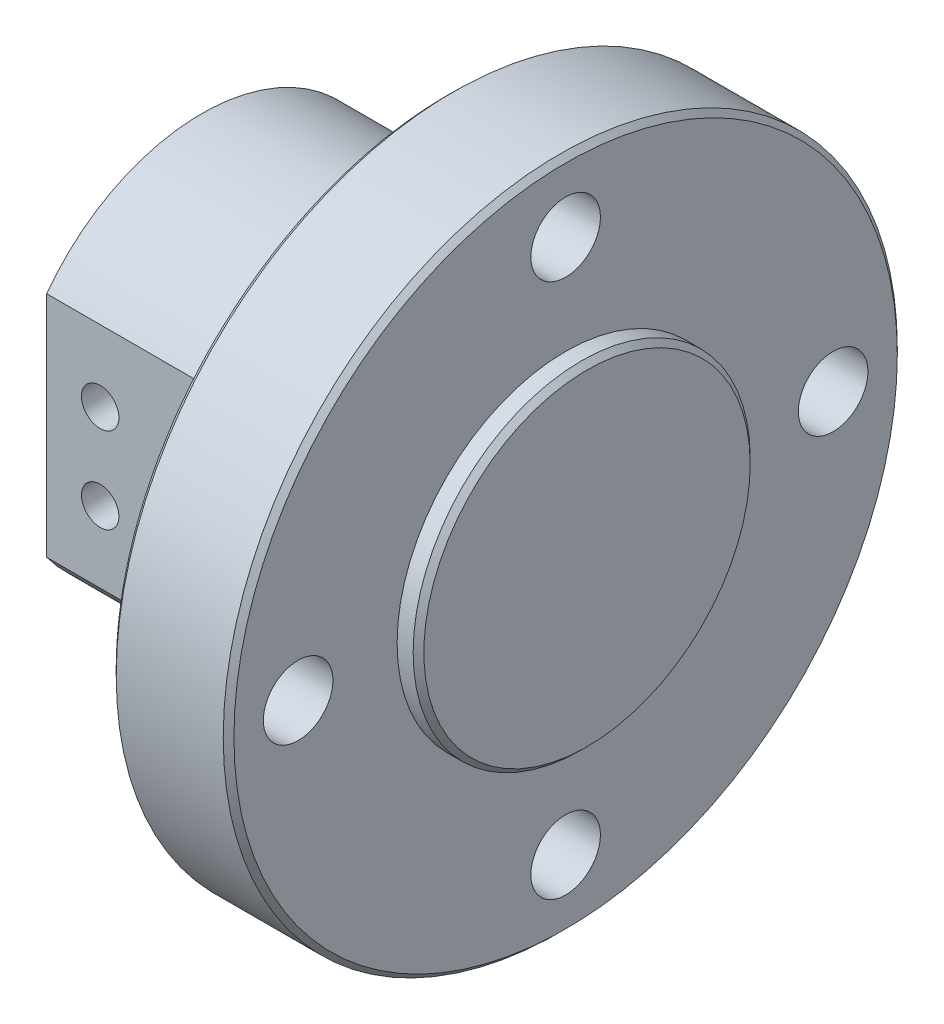
ISO-10303-21;
HEADER;
FILE_DESCRIPTION(('STEP AP214'),'2;1');
FILE_NAME('part.step','',(''),(''),'','','');
FILE_SCHEMA(('AUTOMOTIVE_DESIGN { 1 0 10303 214 1 1 1 1 }'));
ENDSEC;
DATA;
#1=APPLICATION_CONTEXT('core data for automotive mechanical design processes');
#2=APPLICATION_PROTOCOL_DEFINITION('international standard','automotive_design',2000,#1);
#3=PRODUCT_CONTEXT('',#1,'mechanical');
#4=PRODUCT('Part','Part','',(#3));
#5=PRODUCT_RELATED_PRODUCT_CATEGORY('part','',(#4));
#6=PRODUCT_DEFINITION_FORMATION('','',#4);
#7=PRODUCT_DEFINITION_CONTEXT('part definition',#1,'design');
#8=PRODUCT_DEFINITION('design','',#6,#7);
#9=PRODUCT_DEFINITION_SHAPE('','',#8);
#10=(LENGTH_UNIT() NAMED_UNIT(*) SI_UNIT(.MILLI.,.METRE.));
#11=(NAMED_UNIT(*) PLANE_ANGLE_UNIT() SI_UNIT($,.RADIAN.));
#12=(NAMED_UNIT(*) SI_UNIT($,.STERADIAN.) SOLID_ANGLE_UNIT());
#13=UNCERTAINTY_MEASURE_WITH_UNIT(LENGTH_MEASURE(1.E-05),#10,'distance_accuracy_value','');
#14=(GEOMETRIC_REPRESENTATION_CONTEXT(3) GLOBAL_UNCERTAINTY_ASSIGNED_CONTEXT((#13)) GLOBAL_UNIT_ASSIGNED_CONTEXT((#10,
#11,#12)) REPRESENTATION_CONTEXT('',''));
#15=CARTESIAN_POINT('',(0.,0.,0.));
#16=DIRECTION('',(0.,0.,1.));
#17=DIRECTION('',(1.,0.,0.));
#18=AXIS2_PLACEMENT_3D('',#15,#16,#17);
#19=CARTESIAN_POINT('',(13.,0.,25.));
#20=DIRECTION('',(-1.,0.,0.));
#21=DIRECTION('',(0.,0.,1.));
#22=AXIS2_PLACEMENT_3D('',#19,#20,#21);
#23=CYLINDRICAL_SURFACE('',#22,3.25);
#24=CARTESIAN_POINT('',(11.,0.,25.));
#25=DIRECTION('',(1.,0.,0.));
#26=DIRECTION('',(0.,0.,-1.));
#27=AXIS2_PLACEMENT_3D('',#24,#25,#26);
#28=CIRCLE('',#27,3.25);
#29=CARTESIAN_POINT('',(11.,0.,28.25));
#30=VERTEX_POINT('',#29);
#31=EDGE_CURVE('E294',#30,#30,#28,.T.);
#32=CARTESIAN_POINT('',(5.,0.,25.));
#33=DIRECTION('',(-1.,0.,0.));
#34=DIRECTION('',(0.,0.,1.));
#35=AXIS2_PLACEMENT_3D('',#32,#33,#34);
#36=CIRCLE('',#35,3.25);
#37=CARTESIAN_POINT('',(5.,0.,28.25));
#38=VERTEX_POINT('',#37);
#39=EDGE_CURVE('E47',#38,#38,#36,.F.);
#40=CARTESIAN_POINT('',(11.,0.,28.25));
#41=CARTESIAN_POINT('',(10.9375,0.,28.25));
#42=CARTESIAN_POINT('',(10.875,0.,28.25));
#43=CARTESIAN_POINT('',(10.75,0.,28.25));
#44=CARTESIAN_POINT('',(10.6875,0.,28.25));
#45=CARTESIAN_POINT('',(10.5625,0.,28.25));
#46=CARTESIAN_POINT('',(10.5,0.,28.25));
#47=CARTESIAN_POINT('',(10.375,0.,28.25));
#48=CARTESIAN_POINT('',(10.3125,0.,28.25));
#49=CARTESIAN_POINT('',(10.1875,0.,28.25));
#50=CARTESIAN_POINT('',(10.125,0.,28.25));
#51=CARTESIAN_POINT('',(10.,0.,28.25));
#52=CARTESIAN_POINT('',(9.9375,0.,28.25));
#53=CARTESIAN_POINT('',(9.8125,0.,28.25));
#54=CARTESIAN_POINT('',(9.75,0.,28.25));
#55=CARTESIAN_POINT('',(9.625,0.,28.25));
#56=CARTESIAN_POINT('',(9.5625,0.,28.25));
#57=CARTESIAN_POINT('',(9.4375,0.,28.25));
#58=CARTESIAN_POINT('',(9.375,0.,28.25));
#59=CARTESIAN_POINT('',(9.25,0.,28.25));
#60=CARTESIAN_POINT('',(9.1875,0.,28.25));
#61=CARTESIAN_POINT('',(9.0625,0.,28.25));
#62=CARTESIAN_POINT('',(9.,0.,28.25));
#63=CARTESIAN_POINT('',(8.875,0.,28.25));
#64=CARTESIAN_POINT('',(8.8125,0.,28.25));
#65=CARTESIAN_POINT('',(8.6875,0.,28.25));
#66=CARTESIAN_POINT('',(8.625,0.,28.25));
#67=CARTESIAN_POINT('',(8.5,0.,28.25));
#68=CARTESIAN_POINT('',(8.4375,0.,28.25));
#69=CARTESIAN_POINT('',(8.3125,0.,28.25));
#70=CARTESIAN_POINT('',(8.25,0.,28.25));
#71=CARTESIAN_POINT('',(8.125,0.,28.25));
#72=CARTESIAN_POINT('',(8.0625,0.,28.25));
#73=CARTESIAN_POINT('',(7.9375,0.,28.25));
#74=CARTESIAN_POINT('',(7.875,0.,28.25));
#75=CARTESIAN_POINT('',(7.75,0.,28.25));
#76=CARTESIAN_POINT('',(7.6875,0.,28.25));
#77=CARTESIAN_POINT('',(7.5625,0.,28.25));
#78=CARTESIAN_POINT('',(7.5,0.,28.25));
#79=CARTESIAN_POINT('',(7.375,0.,28.25));
#80=CARTESIAN_POINT('',(7.3125,0.,28.25));
#81=CARTESIAN_POINT('',(7.1875,0.,28.25));
#82=CARTESIAN_POINT('',(7.125,0.,28.25));
#83=CARTESIAN_POINT('',(7.,0.,28.25));
#84=CARTESIAN_POINT('',(6.9375,0.,28.25));
#85=CARTESIAN_POINT('',(6.8125,0.,28.25));
#86=CARTESIAN_POINT('',(6.75,0.,28.25));
#87=CARTESIAN_POINT('',(6.625,0.,28.25));
#88=CARTESIAN_POINT('',(6.5625,0.,28.25));
#89=CARTESIAN_POINT('',(6.4375,0.,28.25));
#90=CARTESIAN_POINT('',(6.375,0.,28.25));
#91=CARTESIAN_POINT('',(6.25,0.,28.25));
#92=CARTESIAN_POINT('',(6.1875,0.,28.25));
#93=CARTESIAN_POINT('',(6.0625,0.,28.25));
#94=CARTESIAN_POINT('',(6.,0.,28.25));
#95=CARTESIAN_POINT('',(5.875,0.,28.25));
#96=CARTESIAN_POINT('',(5.8125,0.,28.25));
#97=CARTESIAN_POINT('',(5.6875,0.,28.25));
#98=CARTESIAN_POINT('',(5.625,0.,28.25));
#99=CARTESIAN_POINT('',(5.5,0.,28.25));
#100=CARTESIAN_POINT('',(5.4375,0.,28.25));
#101=CARTESIAN_POINT('',(5.3125,0.,28.25));
#102=CARTESIAN_POINT('',(5.25,0.,28.25));
#103=CARTESIAN_POINT('',(5.125,0.,28.25));
#104=CARTESIAN_POINT('',(5.0625,0.,28.25));
#105=CARTESIAN_POINT('',(5.,0.,28.25));
#106=B_SPLINE_CURVE_WITH_KNOTS('',3,(#40,#41,#42,#43,#44,#45,#46,#47,#48,#49,#50,#51,#52,#53,
#54,#55,#56,#57,#58,#59,#60,#61,#62,#63,#64,#65,#66,#67,#68,#69,#70,#71,#72,#73,#74,#75,#76,#77,
#78,#79,#80,#81,#82,#83,#84,#85,#86,#87,#88,#89,#90,#91,#92,#93,#94,#95,#96,#97,#98,#99,#100,
#101,#102,#103,#104,#105),.UNSPECIFIED.,.F.,.F.,(4,2,2,2,2,2,2,2,2,2,2,2,2,2,2,2,2,2,2,2,2,2,2,
2,2,2,2,2,2,2,2,2,4),(0.,0.1875,0.374999999999999,0.562499999999999,0.749999999999999,
0.937499999999999,1.125,1.3125,1.5,1.6875,1.875,2.0625,2.25,2.4375,2.625,2.8125,3.,3.1875,3.375,
3.5625,3.75,3.9375,4.125,4.3125,4.5,4.6875,4.875,5.0625,5.25,5.4375,5.625,5.8125,6.),.UNSPECIFIED.);
#107=EDGE_CURVE('BSEAM42',#30,#38,#106,.T.);
#108=ORIENTED_EDGE('',*,*,#31,.T.);
#109=ORIENTED_EDGE('',*,*,#39,.F.);
#110=ORIENTED_EDGE('',*,*,#107,.T.);
#111=ORIENTED_EDGE('',*,*,#107,.F.);
#112=EDGE_LOOP('',(#108,#110,#109,#111));
#113=FACE_BOUND('',#112,.T.);
#114=ADVANCED_FACE('F42',(#113),#23,.F.);
#115=CARTESIAN_POINT('',(13.,0.,-25.));
#116=DIRECTION('',(-1.,0.,0.));
#117=DIRECTION('',(0.,0.,1.));
#118=AXIS2_PLACEMENT_3D('',#115,#116,#117);
#119=CYLINDRICAL_SURFACE('',#118,3.25);
#120=CARTESIAN_POINT('',(11.,0.,-25.));
#121=DIRECTION('',(1.,0.,0.));
#122=DIRECTION('',(0.,0.,-1.));
#123=AXIS2_PLACEMENT_3D('',#120,#121,#122);
#124=CIRCLE('',#123,3.25);
#125=CARTESIAN_POINT('',(11.,0.,-21.75));
#126=VERTEX_POINT('',#125);
#127=EDGE_CURVE('E309',#126,#126,#124,.T.);
#128=CARTESIAN_POINT('',(5.,0.,-25.));
#129=DIRECTION('',(-1.,0.,0.));
#130=DIRECTION('',(0.,0.,1.));
#131=AXIS2_PLACEMENT_3D('',#128,#129,#130);
#132=CIRCLE('',#131,3.25);
#133=CARTESIAN_POINT('',(5.,0.,-21.75));
#134=VERTEX_POINT('',#133);
#135=EDGE_CURVE('E287',#134,#134,#132,.F.);
#136=CARTESIAN_POINT('',(11.,0.,-21.75));
#137=CARTESIAN_POINT('',(10.9375,0.,-21.75));
#138=CARTESIAN_POINT('',(10.875,0.,-21.75));
#139=CARTESIAN_POINT('',(10.75,0.,-21.75));
#140=CARTESIAN_POINT('',(10.6875,0.,-21.75));
#141=CARTESIAN_POINT('',(10.5625,0.,-21.75));
#142=CARTESIAN_POINT('',(10.5,0.,-21.75));
#143=CARTESIAN_POINT('',(10.375,0.,-21.75));
#144=CARTESIAN_POINT('',(10.3125,0.,-21.75));
#145=CARTESIAN_POINT('',(10.1875,0.,-21.75));
#146=CARTESIAN_POINT('',(10.125,0.,-21.75));
#147=CARTESIAN_POINT('',(10.,0.,-21.75));
#148=CARTESIAN_POINT('',(9.9375,0.,-21.75));
#149=CARTESIAN_POINT('',(9.8125,0.,-21.75));
#150=CARTESIAN_POINT('',(9.75,0.,-21.75));
#151=CARTESIAN_POINT('',(9.625,0.,-21.75));
#152=CARTESIAN_POINT('',(9.5625,0.,-21.75));
#153=CARTESIAN_POINT('',(9.4375,0.,-21.75));
#154=CARTESIAN_POINT('',(9.375,0.,-21.75));
#155=CARTESIAN_POINT('',(9.25,0.,-21.75));
#156=CARTESIAN_POINT('',(9.1875,0.,-21.75));
#157=CARTESIAN_POINT('',(9.0625,0.,-21.75));
#158=CARTESIAN_POINT('',(9.,0.,-21.75));
#159=CARTESIAN_POINT('',(8.875,0.,-21.75));
#160=CARTESIAN_POINT('',(8.8125,0.,-21.75));
#161=CARTESIAN_POINT('',(8.6875,0.,-21.75));
#162=CARTESIAN_POINT('',(8.625,0.,-21.75));
#163=CARTESIAN_POINT('',(8.5,0.,-21.75));
#164=CARTESIAN_POINT('',(8.4375,0.,-21.75));
#165=CARTESIAN_POINT('',(8.3125,0.,-21.75));
#166=CARTESIAN_POINT('',(8.25,0.,-21.75));
#167=CARTESIAN_POINT('',(8.125,0.,-21.75));
#168=CARTESIAN_POINT('',(8.0625,0.,-21.75));
#169=CARTESIAN_POINT('',(7.9375,0.,-21.75));
#170=CARTESIAN_POINT('',(7.875,0.,-21.75));
#171=CARTESIAN_POINT('',(7.75,0.,-21.75));
#172=CARTESIAN_POINT('',(7.6875,0.,-21.75));
#173=CARTESIAN_POINT('',(7.5625,0.,-21.75));
#174=CARTESIAN_POINT('',(7.5,0.,-21.75));
#175=CARTESIAN_POINT('',(7.375,0.,-21.75));
#176=CARTESIAN_POINT('',(7.3125,0.,-21.75));
#177=CARTESIAN_POINT('',(7.1875,0.,-21.75));
#178=CARTESIAN_POINT('',(7.125,0.,-21.75));
#179=CARTESIAN_POINT('',(7.,0.,-21.75));
#180=CARTESIAN_POINT('',(6.9375,0.,-21.75));
#181=CARTESIAN_POINT('',(6.8125,0.,-21.75));
#182=CARTESIAN_POINT('',(6.75,0.,-21.75));
#183=CARTESIAN_POINT('',(6.625,0.,-21.75));
#184=CARTESIAN_POINT('',(6.5625,0.,-21.75));
#185=CARTESIAN_POINT('',(6.4375,0.,-21.75));
#186=CARTESIAN_POINT('',(6.375,0.,-21.75));
#187=CARTESIAN_POINT('',(6.25,0.,-21.75));
#188=CARTESIAN_POINT('',(6.1875,0.,-21.75));
#189=CARTESIAN_POINT('',(6.0625,0.,-21.75));
#190=CARTESIAN_POINT('',(6.,0.,-21.75));
#191=CARTESIAN_POINT('',(5.875,0.,-21.75));
#192=CARTESIAN_POINT('',(5.8125,0.,-21.75));
#193=CARTESIAN_POINT('',(5.6875,0.,-21.75));
#194=CARTESIAN_POINT('',(5.625,0.,-21.75));
#195=CARTESIAN_POINT('',(5.5,0.,-21.75));
#196=CARTESIAN_POINT('',(5.4375,0.,-21.75));
#197=CARTESIAN_POINT('',(5.3125,0.,-21.75));
#198=CARTESIAN_POINT('',(5.25,0.,-21.75));
#199=CARTESIAN_POINT('',(5.125,0.,-21.75));
#200=CARTESIAN_POINT('',(5.0625,0.,-21.75));
#201=CARTESIAN_POINT('',(5.,0.,-21.75));
#202=B_SPLINE_CURVE_WITH_KNOTS('',3,(#136,#137,#138,#139,#140,#141,#142,#143,#144,#145,#146,
#147,#148,#149,#150,#151,#152,#153,#154,#155,#156,#157,#158,#159,#160,#161,#162,#163,#164,#165,
#166,#167,#168,#169,#170,#171,#172,#173,#174,#175,#176,#177,#178,#179,#180,#181,#182,#183,#184,
#185,#186,#187,#188,#189,#190,#191,#192,#193,#194,#195,#196,#197,#198,#199,#200,#201),
.UNSPECIFIED.,.F.,.F.,(4,2,2,2,2,2,2,2,2,2,2,2,2,2,2,2,2,2,2,2,2,2,2,2,2,2,2,2,2,2,2,2,4),(0.,
0.1875,0.374999999999999,0.562499999999999,0.749999999999999,0.937499999999999,1.125,1.3125,1.5,
1.6875,1.875,2.0625,2.25,2.4375,2.625,2.8125,3.,3.1875,3.375,3.5625,3.75,3.9375,4.125,4.3125,
4.5,4.6875,4.875,5.0625,5.25,5.4375,5.625,5.8125,6.),.UNSPECIFIED.);
#203=EDGE_CURVE('BSEAM430',#126,#134,#202,.T.);
#204=ORIENTED_EDGE('',*,*,#127,.T.);
#205=ORIENTED_EDGE('',*,*,#135,.F.);
#206=ORIENTED_EDGE('',*,*,#203,.T.);
#207=ORIENTED_EDGE('',*,*,#203,.F.);
#208=EDGE_LOOP('',(#204,#206,#205,#207));
#209=FACE_BOUND('',#208,.T.);
#210=ADVANCED_FACE('F430',(#209),#119,.F.);
#211=CARTESIAN_POINT('',(-23.,0.,0.));
#212=DIRECTION('',(-1.,0.,0.));
#213=DIRECTION('',(0.,0.,1.));
#214=AXIS2_PLACEMENT_3D('',#211,#212,#213);
#215=PLANE('',#214);
#216=DIRECTION('',(0.,-1.,0.));
#217=VECTOR('',#216,1.);
#218=CARTESIAN_POINT('',(-23.,0.,14.5));
#219=LINE('',#218,#217);
#220=CARTESIAN_POINT('',(-23.,10.6653645038508,14.5));
#221=VERTEX_POINT('',#220);
#222=CARTESIAN_POINT('',(-23.,-10.6653645038508,14.5));
#223=VERTEX_POINT('',#222);
#224=EDGE_CURVE('E146',#221,#223,#219,.T.);
#225=ORIENTED_EDGE('',*,*,#224,.F.);
#226=CARTESIAN_POINT('',(-23.,0.,0.));
#227=DIRECTION('',(-1.,0.,0.));
#228=DIRECTION('',(0.,0.,1.));
#229=AXIS2_PLACEMENT_3D('',#226,#227,#228);
#230=CIRCLE('',#229,18.);
#231=CARTESIAN_POINT('',(-23.,10.6653645038508,-14.5));
#232=VERTEX_POINT('',#231);
#233=EDGE_CURVE('E160',#221,#232,#230,.T.);
#234=ORIENTED_EDGE('',*,*,#233,.T.);
#235=DIRECTION('',(0.,-1.,0.));
#236=VECTOR('',#235,1.);
#237=CARTESIAN_POINT('',(-23.,0.,-14.5));
#238=LINE('',#237,#236);
#239=CARTESIAN_POINT('',(-23.,-10.6653645038508,-14.5));
#240=VERTEX_POINT('',#239);
#241=EDGE_CURVE('E172',#232,#240,#238,.T.);
#242=ORIENTED_EDGE('',*,*,#241,.T.);
#243=EDGE_CURVE('E219',#240,#223,#230,.T.);
#244=ORIENTED_EDGE('',*,*,#243,.T.);
#245=EDGE_LOOP('',(#225,#234,#242,#244));
#246=FACE_BOUND('',#245,.T.);
#247=CARTESIAN_POINT('',(-23.,0.,0.));
#248=DIRECTION('',(-1.,0.,0.));
#249=DIRECTION('',(0.,0.,1.));
#250=AXIS2_PLACEMENT_3D('',#247,#248,#249);
#251=CIRCLE('',#250,10.5);
#252=CARTESIAN_POINT('',(-23.,6.16441400296898,8.5));
#253=VERTEX_POINT('',#252);
#254=CARTESIAN_POINT('',(-23.,6.16441400296898,-8.5));
#255=VERTEX_POINT('',#254);
#256=EDGE_CURVE('E216',#253,#255,#251,.T.);
#257=ORIENTED_EDGE('',*,*,#256,.F.);
#258=DIRECTION('',(0.,-1.,0.));
#259=VECTOR('',#258,1.);
#260=CARTESIAN_POINT('',(-23.,0.,8.5));
#261=LINE('',#260,#259);
#262=CARTESIAN_POINT('',(-23.,-6.16441400296898,8.5));
#263=VERTEX_POINT('',#262);
#264=EDGE_CURVE('E204',#253,#263,#261,.T.);
#265=ORIENTED_EDGE('',*,*,#264,.T.);
#266=CARTESIAN_POINT('',(-23.,-6.16441400296898,-8.5));
#267=VERTEX_POINT('',#266);
#268=EDGE_CURVE('E220',#267,#263,#251,.T.);
#269=ORIENTED_EDGE('',*,*,#268,.F.);
#270=DIRECTION('',(0.,-1.,0.));
#271=VECTOR('',#270,1.);
#272=CARTESIAN_POINT('',(-23.,0.,-8.5));
#273=LINE('',#272,#271);
#274=EDGE_CURVE('E186',#255,#267,#273,.T.);
#275=ORIENTED_EDGE('',*,*,#274,.F.);
#276=EDGE_LOOP('',(#257,#265,#269,#275));
#277=FACE_BOUND('',#276,.T.);
#278=ADVANCED_FACE('F380',(#246,#277),#215,.T.);
#279=CARTESIAN_POINT('',(-23.,0.,0.));
#280=DIRECTION('',(1.,0.,0.));
#281=DIRECTION('',(0.,0.,-1.));
#282=AXIS2_PLACEMENT_3D('',#279,#280,#281);
#283=CYLINDRICAL_SURFACE('',#282,18.);
#284=ORIENTED_EDGE('',*,*,#233,.F.);
#285=DIRECTION('',(-1.,0.,0.));
#286=VECTOR('',#285,1.);
#287=CARTESIAN_POINT('',(-1.,10.6653645038508,14.5));
#288=LINE('',#287,#286);
#289=CARTESIAN_POINT('',(-1.,10.6653645038508,14.5));
#290=VERTEX_POINT('',#289);
#291=EDGE_CURVE('E150',#290,#221,#288,.T.);
#292=ORIENTED_EDGE('',*,*,#291,.F.);
#293=CARTESIAN_POINT('',(-1.,0.,0.));
#294=DIRECTION('',(-1.,0.,0.));
#295=DIRECTION('',(0.,0.,1.));
#296=AXIS2_PLACEMENT_3D('',#293,#294,#295);
#297=CIRCLE('',#296,18.);
#298=CARTESIAN_POINT('',(-1.,-10.6653645038508,14.5));
#299=VERTEX_POINT('',#298);
#300=EDGE_CURVE('E137',#299,#290,#297,.T.);
#301=ORIENTED_EDGE('',*,*,#300,.F.);
#302=DIRECTION('',(-1.,0.,0.));
#303=VECTOR('',#302,1.);
#304=CARTESIAN_POINT('',(-1.,-10.6653645038508,14.5));
#305=LINE('',#304,#303);
#306=EDGE_CURVE('E152',#299,#223,#305,.T.);
#307=ORIENTED_EDGE('',*,*,#306,.T.);
#308=ORIENTED_EDGE('',*,*,#243,.F.);
#309=DIRECTION('',(-1.,0.,0.));
#310=VECTOR('',#309,1.);
#311=CARTESIAN_POINT('',(-1.,-10.6653645038508,-14.5));
#312=LINE('',#311,#310);
#313=CARTESIAN_POINT('',(-1.,-10.6653645038508,-14.5));
#314=VERTEX_POINT('',#313);
#315=EDGE_CURVE('E181',#314,#240,#312,.T.);
#316=ORIENTED_EDGE('',*,*,#315,.F.);
#317=CARTESIAN_POINT('',(-1.,0.,0.));
#318=DIRECTION('',(-1.,0.,0.));
#319=DIRECTION('',(0.,0.,1.));
#320=AXIS2_PLACEMENT_3D('',#317,#318,#319);
#321=CIRCLE('',#320,18.);
#322=CARTESIAN_POINT('',(-1.,10.6653645038508,-14.5));
#323=VERTEX_POINT('',#322);
#324=EDGE_CURVE('E171',#323,#314,#321,.T.);
#325=ORIENTED_EDGE('',*,*,#324,.F.);
#326=DIRECTION('',(-1.,0.,0.));
#327=VECTOR('',#326,1.);
#328=CARTESIAN_POINT('',(-1.,10.6653645038508,-14.5));
#329=LINE('',#328,#327);
#330=EDGE_CURVE('E176',#323,#232,#329,.T.);
#331=ORIENTED_EDGE('',*,*,#330,.T.);
#332=EDGE_LOOP('',(#284,#292,#301,#307,#308,#316,#325,#331));
#333=FACE_BOUND('',#332,.T.);
#334=CARTESIAN_POINT('',(0.,0.,0.));
#335=DIRECTION('',(-1.,0.,0.));
#336=DIRECTION('',(0.,0.,1.));
#337=AXIS2_PLACEMENT_3D('',#334,#335,#336);
#338=CIRCLE('',#337,18.);
#339=CARTESIAN_POINT('',(0.,0.,18.));
#340=VERTEX_POINT('',#339);
#341=EDGE_CURVE('E11',#340,#340,#338,.T.);
#342=ORIENTED_EDGE('',*,*,#341,.T.);
#343=EDGE_LOOP('',(#342));
#344=FACE_BOUND('',#343,.T.);
#345=ADVANCED_FACE('F156',(#333,#344),#283,.T.);
#346=CARTESIAN_POINT('',(-23.,0.,0.));
#347=DIRECTION('',(1.,0.,0.));
#348=DIRECTION('',(0.,0.,-1.));
#349=AXIS2_PLACEMENT_3D('',#346,#347,#348);
#350=CYLINDRICAL_SURFACE('',#349,10.5);
#351=ORIENTED_EDGE('',*,*,#256,.T.);
#352=DIRECTION('',(-1.,0.,0.));
#353=VECTOR('',#352,1.);
#354=CARTESIAN_POINT('',(13.002,6.16441400296898,-8.5));
#355=LINE('',#354,#353);
#356=CARTESIAN_POINT('',(0.,6.16441400296898,-8.5));
#357=VERTEX_POINT('',#356);
#358=EDGE_CURVE('E192',#357,#255,#355,.T.);
#359=ORIENTED_EDGE('',*,*,#358,.F.);
#360=CARTESIAN_POINT('',(0.,0.,0.));
#361=DIRECTION('',(-1.,0.,0.));
#362=DIRECTION('',(0.,0.,1.));
#363=AXIS2_PLACEMENT_3D('',#360,#361,#362);
#364=CIRCLE('',#363,10.5);
#365=CARTESIAN_POINT('',(0.,6.16441400296898,8.5));
#366=VERTEX_POINT('',#365);
#367=EDGE_CURVE('E221',#366,#357,#364,.T.);
#368=ORIENTED_EDGE('',*,*,#367,.F.);
#369=DIRECTION('',(-1.,0.,0.));
#370=VECTOR('',#369,1.);
#371=CARTESIAN_POINT('',(13.002,6.16441400296898,8.5));
#372=LINE('',#371,#370);
#373=EDGE_CURVE('E203',#366,#253,#372,.T.);
#374=ORIENTED_EDGE('',*,*,#373,.T.);
#375=EDGE_LOOP('',(#351,#359,#368,#374));
#376=FACE_BOUND('',#375,.T.);
#377=ADVANCED_FACE('F403',(#376),#350,.F.);
#378=CARTESIAN_POINT('',(0.,-6.16441400296898,-8.5));
#379=VERTEX_POINT('',#378);
#380=CARTESIAN_POINT('',(0.,-6.16441400296898,8.5));
#381=VERTEX_POINT('',#380);
#382=EDGE_CURVE('E208',#379,#381,#364,.T.);
#383=ORIENTED_EDGE('',*,*,#382,.F.);
#384=DIRECTION('',(-1.,0.,0.));
#385=VECTOR('',#384,1.);
#386=CARTESIAN_POINT('',(13.002,-6.16441400296898,-8.5));
#387=LINE('',#386,#385);
#388=EDGE_CURVE('E191',#379,#267,#387,.T.);
#389=ORIENTED_EDGE('',*,*,#388,.T.);
#390=ORIENTED_EDGE('',*,*,#268,.T.);
#391=DIRECTION('',(-1.,0.,0.));
#392=VECTOR('',#391,1.);
#393=CARTESIAN_POINT('',(13.002,-6.16441400296898,8.5));
#394=LINE('',#393,#392);
#395=EDGE_CURVE('E209',#381,#263,#394,.T.);
#396=ORIENTED_EDGE('',*,*,#395,.F.);
#397=EDGE_LOOP('',(#383,#389,#390,#396));
#398=FACE_BOUND('',#397,.T.);
#399=ADVANCED_FACE('F394',(#398),#350,.F.);
#400=CARTESIAN_POINT('',(0.,0.,0.));
#401=DIRECTION('',(1.,0.,0.));
#402=DIRECTION('',(0.,0.,-1.));
#403=AXIS2_PLACEMENT_3D('',#400,#401,#402);
#404=PLANE('',#403);
#405=DIRECTION('',(0.,-1.,0.));
#406=VECTOR('',#405,1.);
#407=CARTESIAN_POINT('',(0.,0.,-8.5));
#408=LINE('',#407,#406);
#409=EDGE_CURVE('E164',#357,#379,#408,.T.);
#410=ORIENTED_EDGE('',*,*,#409,.T.);
#411=ORIENTED_EDGE('',*,*,#382,.T.);
#412=DIRECTION('',(0.,-1.,0.));
#413=VECTOR('',#412,1.);
#414=CARTESIAN_POINT('',(0.,0.,8.5));
#415=LINE('',#414,#413);
#416=EDGE_CURVE('E190',#366,#381,#415,.T.);
#417=ORIENTED_EDGE('',*,*,#416,.F.);
#418=ORIENTED_EDGE('',*,*,#367,.T.);
#419=EDGE_LOOP('',(#410,#411,#417,#418));
#420=FACE_BOUND('',#419,.T.);
#421=ADVANCED_FACE('F409',(#420),#404,.F.);
#422=CARTESIAN_POINT('',(11.,-25.,0.));
#423=DIRECTION('',(-1.,0.,0.));
#424=DIRECTION('',(0.,0.,1.));
#425=AXIS2_PLACEMENT_3D('',#422,#423,#424);
#426=CYLINDRICAL_SURFACE('',#425,3.25);
#427=CARTESIAN_POINT('',(11.,-25.,0.));
#428=DIRECTION('',(-1.,0.,0.));
#429=DIRECTION('',(0.,0.,1.));
#430=AXIS2_PLACEMENT_3D('',#427,#428,#429);
#431=CIRCLE('',#430,3.25);
#432=CARTESIAN_POINT('',(11.,-25.,3.25));
#433=VERTEX_POINT('',#432);
#434=EDGE_CURVE('E253',#433,#433,#431,.T.);
#435=ORIENTED_EDGE('',*,*,#434,.F.);
#436=EDGE_LOOP('',(#435));
#437=FACE_BOUND('',#436,.T.);
#438=CARTESIAN_POINT('',(5.,-25.,0.));
#439=DIRECTION('',(-1.,0.,0.));
#440=DIRECTION('',(0.,0.,1.));
#441=AXIS2_PLACEMENT_3D('',#438,#439,#440);
#442=CIRCLE('',#441,3.25);
#443=CARTESIAN_POINT('',(5.,-25.,3.25));
#444=VERTEX_POINT('',#443);
#445=EDGE_CURVE('E256',#444,#444,#442,.F.);
#446=ORIENTED_EDGE('',*,*,#445,.F.);
#447=EDGE_LOOP('',(#446));
#448=FACE_BOUND('',#447,.T.);
#449=ADVANCED_FACE('F412',(#437,#448),#426,.F.);
#450=CARTESIAN_POINT('',(11.,25.,0.));
#451=DIRECTION('',(-1.,0.,0.));
#452=DIRECTION('',(0.,0.,1.));
#453=AXIS2_PLACEMENT_3D('',#450,#451,#452);
#454=CYLINDRICAL_SURFACE('',#453,3.25);
#455=CARTESIAN_POINT('',(11.,25.,0.));
#456=DIRECTION('',(-1.,0.,0.));
#457=DIRECTION('',(0.,0.,1.));
#458=AXIS2_PLACEMENT_3D('',#455,#456,#457);
#459=CIRCLE('',#458,3.25);
#460=CARTESIAN_POINT('',(11.,25.,3.25));
#461=VERTEX_POINT('',#460);
#462=EDGE_CURVE('E248',#461,#461,#459,.T.);
#463=ORIENTED_EDGE('',*,*,#462,.F.);
#464=EDGE_LOOP('',(#463));
#465=FACE_BOUND('',#464,.T.);
#466=CARTESIAN_POINT('',(5.,25.,0.));
#467=DIRECTION('',(-1.,0.,0.));
#468=DIRECTION('',(0.,0.,1.));
#469=AXIS2_PLACEMENT_3D('',#466,#467,#468);
#470=CIRCLE('',#469,3.25);
#471=CARTESIAN_POINT('',(5.,25.,3.25));
#472=VERTEX_POINT('',#471);
#473=EDGE_CURVE('E237',#472,#472,#470,.F.);
#474=ORIENTED_EDGE('',*,*,#473,.F.);
#475=EDGE_LOOP('',(#474));
#476=FACE_BOUND('',#475,.T.);
#477=ADVANCED_FACE('F419',(#465,#476),#454,.F.);
#478=CARTESIAN_POINT('',(11.,0.,0.));
#479=DIRECTION('',(-1.,0.,0.));
#480=DIRECTION('',(0.,0.,1.));
#481=AXIS2_PLACEMENT_3D('',#478,#479,#480);
#482=CYLINDRICAL_SURFACE('',#481,31.5);
#483=CARTESIAN_POINT('',(10.5,0.,0.));
#484=DIRECTION('',(1.,0.,0.));
#485=DIRECTION('',(0.,0.,-1.));
#486=AXIS2_PLACEMENT_3D('',#483,#484,#485);
#487=CIRCLE('',#486,31.5);
#488=CARTESIAN_POINT('',(10.5,0.,-31.5));
#489=VERTEX_POINT('',#488);
#490=EDGE_CURVE('E269',#489,#489,#487,.F.);
#491=ORIENTED_EDGE('',*,*,#490,.T.);
#492=EDGE_LOOP('',(#491));
#493=FACE_BOUND('',#492,.T.);
#494=CARTESIAN_POINT('',(0.499999999999994,0.,0.));
#495=DIRECTION('',(1.,0.,0.));
#496=DIRECTION('',(0.,0.,-1.));
#497=AXIS2_PLACEMENT_3D('',#494,#495,#496);
#498=CIRCLE('',#497,31.5);
#499=CARTESIAN_POINT('',(0.499999999999994,0.,-31.5));
#500=VERTEX_POINT('',#499);
#501=EDGE_CURVE('E265',#500,#500,#498,.T.);
#502=ORIENTED_EDGE('',*,*,#501,.T.);
#503=EDGE_LOOP('',(#502));
#504=FACE_BOUND('',#503,.T.);
#505=ADVANCED_FACE('F511',(#493,#504),#482,.T.);
#506=CARTESIAN_POINT('',(11.,0.,0.));
#507=DIRECTION('',(1.,0.,0.));
#508=DIRECTION('',(0.,0.,-1.));
#509=AXIS2_PLACEMENT_3D('',#506,#507,#508);
#510=PLANE('',#509);
#511=ORIENTED_EDGE('',*,*,#127,.F.);
#512=EDGE_LOOP('',(#511));
#513=FACE_BOUND('',#512,.T.);
#514=ORIENTED_EDGE('',*,*,#31,.F.);
#515=EDGE_LOOP('',(#514));
#516=FACE_BOUND('',#515,.T.);
#517=CARTESIAN_POINT('',(11.,0.,0.));
#518=DIRECTION('',(1.,0.,0.));
#519=DIRECTION('',(0.,0.,-1.));
#520=AXIS2_PLACEMENT_3D('',#517,#518,#519);
#521=CIRCLE('',#520,15.75);
#522=CARTESIAN_POINT('',(11.,0.,-15.75));
#523=VERTEX_POINT('',#522);
#524=EDGE_CURVE('E227',#523,#523,#521,.T.);
#525=ORIENTED_EDGE('',*,*,#524,.F.);
#526=EDGE_LOOP('',(#525));
#527=FACE_BOUND('',#526,.T.);
#528=CARTESIAN_POINT('',(11.,0.,0.));
#529=DIRECTION('',(1.,0.,0.));
#530=DIRECTION('',(0.,0.,-1.));
#531=AXIS2_PLACEMENT_3D('',#528,#529,#530);
#532=CIRCLE('',#531,31.);
#533=CARTESIAN_POINT('',(11.,0.,-31.));
#534=VERTEX_POINT('',#533);
#535=EDGE_CURVE('E252',#534,#534,#532,.T.);
#536=ORIENTED_EDGE('',*,*,#535,.T.);
#537=EDGE_LOOP('',(#536));
#538=FACE_BOUND('',#537,.T.);
#539=ORIENTED_EDGE('',*,*,#462,.T.);
#540=EDGE_LOOP('',(#539));
#541=FACE_BOUND('',#540,.T.);
#542=ORIENTED_EDGE('',*,*,#434,.T.);
#543=EDGE_LOOP('',(#542));
#544=FACE_BOUND('',#543,.T.);
#545=ADVANCED_FACE('F427',(#513,#516,#527,#538,#541,#544),#510,.T.);
#546=ORIENTED_EDGE('',*,*,#341,.F.);
#547=EDGE_LOOP('',(#546));
#548=FACE_BOUND('',#547,.T.);
#549=CARTESIAN_POINT('',(0.,0.,0.));
#550=DIRECTION('',(1.,0.,0.));
#551=DIRECTION('',(0.,0.,-1.));
#552=AXIS2_PLACEMENT_3D('',#549,#550,#551);
#553=CIRCLE('',#552,31.);
#554=CARTESIAN_POINT('',(0.,31.,0.));
#555=VERTEX_POINT('',#554);
#556=CARTESIAN_POINT('',(0.,1.08235921504137E-13,-31.));
#557=VERTEX_POINT('',#556);
#558=EDGE_CURVE('E274',#555,#557,#553,.F.);
#559=ORIENTED_EDGE('',*,*,#558,.T.);
#560=CARTESIAN_POINT('',(0.,0.,-25.));
#561=DIRECTION('',(-1.,0.,0.));
#562=DIRECTION('',(0.,-1.,0.));
#563=AXIS2_PLACEMENT_3D('',#560,#561,#562);
#564=CIRCLE('',#563,6.);
#565=EDGE_CURVE('E67',#557,#557,#564,.T.);
#566=ORIENTED_EDGE('',*,*,#565,.F.);
#567=CARTESIAN_POINT('',(0.,-31.,0.));
#568=VERTEX_POINT('',#567);
#569=EDGE_CURVE('E273',#557,#568,#553,.F.);
#570=ORIENTED_EDGE('',*,*,#569,.T.);
#571=CARTESIAN_POINT('',(0.,-25.,0.));
#572=DIRECTION('',(-1.,0.,0.));
#573=DIRECTION('',(0.,0.,1.));
#574=AXIS2_PLACEMENT_3D('',#571,#572,#573);
#575=CIRCLE('',#574,6.);
#576=EDGE_CURVE('E225',#568,#568,#575,.T.);
#577=ORIENTED_EDGE('',*,*,#576,.F.);
#578=CARTESIAN_POINT('',(0.,0.,0.));
#579=DIRECTION('',(1.,0.,0.));
#580=DIRECTION('',(0.,0.,-1.));
#581=AXIS2_PLACEMENT_3D('',#578,#579,#580);
#582=CIRCLE('',#581,31.);
#583=CARTESIAN_POINT('',(0.,-1.08235921504137E-13,31.));
#584=VERTEX_POINT('',#583);
#585=EDGE_CURVE('E232',#568,#584,#582,.F.);
#586=ORIENTED_EDGE('',*,*,#585,.T.);
#587=CARTESIAN_POINT('',(0.,0.,25.));
#588=DIRECTION('',(-1.,0.,0.));
#589=DIRECTION('',(0.,-1.,0.));
#590=AXIS2_PLACEMENT_3D('',#587,#588,#589);
#591=CIRCLE('',#590,6.);
#592=EDGE_CURVE('E62',#584,#584,#591,.T.);
#593=ORIENTED_EDGE('',*,*,#592,.F.);
#594=EDGE_CURVE('E278',#584,#555,#582,.F.);
#595=ORIENTED_EDGE('',*,*,#594,.T.);
#596=CARTESIAN_POINT('',(0.,25.,0.));
#597=DIRECTION('',(-1.,0.,0.));
#598=DIRECTION('',(0.,0.,1.));
#599=AXIS2_PLACEMENT_3D('',#596,#597,#598);
#600=CIRCLE('',#599,6.);
#601=EDGE_CURVE('E238',#555,#555,#600,.T.);
#602=ORIENTED_EDGE('',*,*,#601,.F.);
#603=EDGE_LOOP('',(#559,#566,#570,#577,#586,#593,#595,#602));
#604=FACE_BOUND('',#603,.T.);
#605=ADVANCED_FACE('F414',(#548,#604),#404,.F.);
#606=CARTESIAN_POINT('',(5.,25.,0.));
#607=DIRECTION('',(-1.,0.,0.));
#608=DIRECTION('',(0.,0.,1.));
#609=AXIS2_PLACEMENT_3D('',#606,#607,#608);
#610=PLANE('',#609);
#611=CARTESIAN_POINT('',(5.,25.,0.));
#612=DIRECTION('',(-1.,0.,0.));
#613=DIRECTION('',(0.,0.,1.));
#614=AXIS2_PLACEMENT_3D('',#611,#612,#613);
#615=CIRCLE('',#614,6.);
#616=CARTESIAN_POINT('',(5.,25.,6.));
#617=VERTEX_POINT('',#616);
#618=EDGE_CURVE('E233',#617,#617,#615,.T.);
#619=ORIENTED_EDGE('',*,*,#618,.T.);
#620=EDGE_LOOP('',(#619));
#621=FACE_BOUND('',#620,.T.);
#622=ORIENTED_EDGE('',*,*,#473,.T.);
#623=EDGE_LOOP('',(#622));
#624=FACE_BOUND('',#623,.T.);
#625=ADVANCED_FACE('F426',(#621,#624),#610,.T.);
#626=CARTESIAN_POINT('',(5.,25.,0.));
#627=DIRECTION('',(-1.,0.,0.));
#628=DIRECTION('',(0.,0.,1.));
#629=AXIS2_PLACEMENT_3D('',#626,#627,#628);
#630=CYLINDRICAL_SURFACE('',#629,6.);
#631=ORIENTED_EDGE('',*,*,#618,.F.);
#632=EDGE_LOOP('',(#631));
#633=FACE_BOUND('',#632,.T.);
#634=ORIENTED_EDGE('',*,*,#601,.T.);
#635=EDGE_LOOP('',(#634));
#636=FACE_BOUND('',#635,.T.);
#637=ADVANCED_FACE('F496',(#633,#636),#630,.F.);
#638=CARTESIAN_POINT('',(5.,-25.,0.));
#639=DIRECTION('',(-1.,0.,0.));
#640=DIRECTION('',(0.,0.,1.));
#641=AXIS2_PLACEMENT_3D('',#638,#639,#640);
#642=PLANE('',#641);
#643=CARTESIAN_POINT('',(5.,-25.,0.));
#644=DIRECTION('',(-1.,0.,0.));
#645=DIRECTION('',(0.,0.,1.));
#646=AXIS2_PLACEMENT_3D('',#643,#644,#645);
#647=CIRCLE('',#646,6.);
#648=CARTESIAN_POINT('',(5.,-25.,6.));
#649=VERTEX_POINT('',#648);
#650=EDGE_CURVE('E242',#649,#649,#647,.T.);
#651=ORIENTED_EDGE('',*,*,#650,.T.);
#652=EDGE_LOOP('',(#651));
#653=FACE_BOUND('',#652,.T.);
#654=ORIENTED_EDGE('',*,*,#445,.T.);
#655=EDGE_LOOP('',(#654));
#656=FACE_BOUND('',#655,.T.);
#657=ADVANCED_FACE('F500',(#653,#656),#642,.T.);
#658=CARTESIAN_POINT('',(5.,-25.,0.));
#659=DIRECTION('',(-1.,0.,0.));
#660=DIRECTION('',(0.,0.,1.));
#661=AXIS2_PLACEMENT_3D('',#658,#659,#660);
#662=CYLINDRICAL_SURFACE('',#661,6.);
#663=ORIENTED_EDGE('',*,*,#650,.F.);
#664=EDGE_LOOP('',(#663));
#665=FACE_BOUND('',#664,.T.);
#666=ORIENTED_EDGE('',*,*,#576,.T.);
#667=EDGE_LOOP('',(#666));
#668=FACE_BOUND('',#667,.T.);
#669=ADVANCED_FACE('F504',(#665,#668),#662,.F.);
#670=CARTESIAN_POINT('',(11.,0.,0.));
#671=DIRECTION('',(-1.,0.,0.));
#672=DIRECTION('',(0.,0.,1.));
#673=AXIS2_PLACEMENT_3D('',#670,#671,#672);
#674=CONICAL_SURFACE('',#673,31.,0.785398163397448);
#675=ORIENTED_EDGE('',*,*,#490,.F.);
#676=EDGE_LOOP('',(#675));
#677=FACE_BOUND('',#676,.T.);
#678=ORIENTED_EDGE('',*,*,#535,.F.);
#679=EDGE_LOOP('',(#678));
#680=FACE_BOUND('',#679,.T.);
#681=ADVANCED_FACE('F508',(#677,#680),#674,.T.);
#682=CARTESIAN_POINT('',(0.499999999999994,0.,0.));
#683=DIRECTION('',(1.,0.,0.));
#684=DIRECTION('',(0.,0.,-1.));
#685=AXIS2_PLACEMENT_3D('',#682,#683,#684);
#686=CONICAL_SURFACE('',#685,31.5,0.785398163397448);
#687=ORIENTED_EDGE('',*,*,#558,.F.);
#688=ORIENTED_EDGE('',*,*,#594,.F.);
#689=ORIENTED_EDGE('',*,*,#585,.F.);
#690=ORIENTED_EDGE('',*,*,#569,.F.);
#691=EDGE_LOOP('',(#687,#688,#689,#690));
#692=FACE_BOUND('',#691,.T.);
#693=ORIENTED_EDGE('',*,*,#501,.F.);
#694=EDGE_LOOP('',(#693));
#695=FACE_BOUND('',#694,.T.);
#696=ADVANCED_FACE('F492',(#692,#695),#686,.T.);
#697=CARTESIAN_POINT('',(13.,0.,0.));
#698=DIRECTION('',(-1.,0.,0.));
#699=DIRECTION('',(0.,0.,1.));
#700=AXIS2_PLACEMENT_3D('',#697,#698,#699);
#701=CYLINDRICAL_SURFACE('',#700,15.75);
#702=CARTESIAN_POINT('',(12.5,0.,0.));
#703=DIRECTION('',(1.,0.,0.));
#704=DIRECTION('',(0.,0.,-1.));
#705=AXIS2_PLACEMENT_3D('',#702,#703,#704);
#706=CIRCLE('',#705,15.75);
#707=CARTESIAN_POINT('',(12.5,0.,-15.75));
#708=VERTEX_POINT('',#707);
#709=EDGE_CURVE('E53',#708,#708,#706,.F.);
#710=ORIENTED_EDGE('',*,*,#709,.T.);
#711=EDGE_LOOP('',(#710));
#712=FACE_BOUND('',#711,.T.);
#713=ORIENTED_EDGE('',*,*,#524,.T.);
#714=EDGE_LOOP('',(#713));
#715=FACE_BOUND('',#714,.T.);
#716=ADVANCED_FACE('F488',(#712,#715),#701,.T.);
#717=CARTESIAN_POINT('',(13.,0.,0.));
#718=DIRECTION('',(1.,0.,0.));
#719=DIRECTION('',(0.,0.,-1.));
#720=AXIS2_PLACEMENT_3D('',#717,#718,#719);
#721=PLANE('',#720);
#722=CARTESIAN_POINT('',(13.,0.,0.));
#723=DIRECTION('',(1.,0.,0.));
#724=DIRECTION('',(0.,0.,-1.));
#725=AXIS2_PLACEMENT_3D('',#722,#723,#724);
#726=CIRCLE('',#725,15.25);
#727=CARTESIAN_POINT('',(13.,0.,-15.25));
#728=VERTEX_POINT('',#727);
#729=EDGE_CURVE('E231',#728,#728,#726,.T.);
#730=ORIENTED_EDGE('',*,*,#729,.T.);
#731=EDGE_LOOP('',(#730));
#732=FACE_BOUND('',#731,.T.);
#733=ADVANCED_FACE('F485',(#732),#721,.T.);
#734=CARTESIAN_POINT('',(13.,0.,0.));
#735=DIRECTION('',(-1.,0.,0.));
#736=DIRECTION('',(0.,0.,1.));
#737=AXIS2_PLACEMENT_3D('',#734,#735,#736);
#738=CONICAL_SURFACE('',#737,15.25,0.785398163397452);
#739=ORIENTED_EDGE('',*,*,#709,.F.);
#740=EDGE_LOOP('',(#739));
#741=FACE_BOUND('',#740,.T.);
#742=ORIENTED_EDGE('',*,*,#729,.F.);
#743=EDGE_LOOP('',(#742));
#744=FACE_BOUND('',#743,.T.);
#745=ADVANCED_FACE('F45',(#741,#744),#738,.T.);
#746=CARTESIAN_POINT('',(13.002,0.,8.5));
#747=DIRECTION('',(0.,0.,-1.));
#748=DIRECTION('',(-1.,0.,0.));
#749=AXIS2_PLACEMENT_3D('',#746,#747,#748);
#750=PLANE('',#749);
#751=CARTESIAN_POINT('',(-18.,-4.,8.5));
#752=DIRECTION('',(0.,0.,-1.));
#753=DIRECTION('',(-1.,0.,0.));
#754=AXIS2_PLACEMENT_3D('',#751,#752,#753);
#755=CIRCLE('',#754,1.75);
#756=CARTESIAN_POINT('',(-19.75,-4.,8.5));
#757=VERTEX_POINT('',#756);
#758=EDGE_CURVE('E180',#757,#757,#755,.T.);
#759=ORIENTED_EDGE('',*,*,#758,.F.);
#760=EDGE_LOOP('',(#759));
#761=FACE_BOUND('',#760,.T.);
#762=CARTESIAN_POINT('',(-5.99999999999999,-4.,8.5));
#763=DIRECTION('',(0.,0.,-1.));
#764=DIRECTION('',(-1.,0.,0.));
#765=AXIS2_PLACEMENT_3D('',#762,#763,#764);
#766=CIRCLE('',#765,1.75);
#767=CARTESIAN_POINT('',(-7.74999999999999,-4.,8.5));
#768=VERTEX_POINT('',#767);
#769=EDGE_CURVE('E361',#768,#768,#766,.T.);
#770=ORIENTED_EDGE('',*,*,#769,.F.);
#771=EDGE_LOOP('',(#770));
#772=FACE_BOUND('',#771,.T.);
#773=CARTESIAN_POINT('',(-5.99999999999999,4.,8.5));
#774=DIRECTION('',(0.,0.,-1.));
#775=DIRECTION('',(-1.,0.,0.));
#776=AXIS2_PLACEMENT_3D('',#773,#774,#775);
#777=CIRCLE('',#776,1.75);
#778=CARTESIAN_POINT('',(-7.74999999999999,4.,8.5));
#779=VERTEX_POINT('',#778);
#780=EDGE_CURVE('E349',#779,#779,#777,.T.);
#781=ORIENTED_EDGE('',*,*,#780,.F.);
#782=EDGE_LOOP('',(#781));
#783=FACE_BOUND('',#782,.T.);
#784=CARTESIAN_POINT('',(-18.,4.,8.5));
#785=DIRECTION('',(0.,0.,-1.));
#786=DIRECTION('',(-1.,0.,0.));
#787=AXIS2_PLACEMENT_3D('',#784,#785,#786);
#788=CIRCLE('',#787,1.75);
#789=CARTESIAN_POINT('',(-19.75,4.,8.5));
#790=VERTEX_POINT('',#789);
#791=EDGE_CURVE('E337',#790,#790,#788,.T.);
#792=ORIENTED_EDGE('',*,*,#791,.F.);
#793=EDGE_LOOP('',(#792));
#794=FACE_BOUND('',#793,.T.);
#795=ORIENTED_EDGE('',*,*,#373,.F.);
#796=ORIENTED_EDGE('',*,*,#416,.T.);
#797=ORIENTED_EDGE('',*,*,#395,.T.);
#798=ORIENTED_EDGE('',*,*,#264,.F.);
#799=EDGE_LOOP('',(#795,#796,#797,#798));
#800=FACE_BOUND('',#799,.T.);
#801=ADVANCED_FACE('F398',(#761,#772,#783,#794,#800),#750,.T.);
#802=CARTESIAN_POINT('',(13.002,0.,-8.5));
#803=DIRECTION('',(0.,0.,-1.));
#804=DIRECTION('',(-1.,0.,0.));
#805=AXIS2_PLACEMENT_3D('',#802,#803,#804);
#806=PLANE('',#805);
#807=CARTESIAN_POINT('',(-18.,-4.,-8.5));
#808=DIRECTION('',(0.,0.,-1.));
#809=DIRECTION('',(-1.,0.,0.));
#810=AXIS2_PLACEMENT_3D('',#807,#808,#809);
#811=CIRCLE('',#810,1.75);
#812=CARTESIAN_POINT('',(-19.75,-4.,-8.5));
#813=VERTEX_POINT('',#812);
#814=EDGE_CURVE('E369',#813,#813,#811,.T.);
#815=ORIENTED_EDGE('',*,*,#814,.T.);
#816=EDGE_LOOP('',(#815));
#817=FACE_BOUND('',#816,.T.);
#818=CARTESIAN_POINT('',(-5.99999999999999,-4.,-8.5));
#819=DIRECTION('',(0.,0.,-1.));
#820=DIRECTION('',(-1.,0.,0.));
#821=AXIS2_PLACEMENT_3D('',#818,#819,#820);
#822=CIRCLE('',#821,1.75);
#823=CARTESIAN_POINT('',(-7.74999999999999,-4.,-8.5));
#824=VERTEX_POINT('',#823);
#825=EDGE_CURVE('E357',#824,#824,#822,.T.);
#826=ORIENTED_EDGE('',*,*,#825,.T.);
#827=EDGE_LOOP('',(#826));
#828=FACE_BOUND('',#827,.T.);
#829=CARTESIAN_POINT('',(-5.99999999999999,4.,-8.5));
#830=DIRECTION('',(0.,0.,-1.));
#831=DIRECTION('',(-1.,0.,0.));
#832=AXIS2_PLACEMENT_3D('',#829,#830,#831);
#833=CIRCLE('',#832,1.75);
#834=CARTESIAN_POINT('',(-7.74999999999999,4.,-8.5));
#835=VERTEX_POINT('',#834);
#836=EDGE_CURVE('E345',#835,#835,#833,.T.);
#837=ORIENTED_EDGE('',*,*,#836,.T.);
#838=EDGE_LOOP('',(#837));
#839=FACE_BOUND('',#838,.T.);
#840=CARTESIAN_POINT('',(-18.,4.,-8.5));
#841=DIRECTION('',(0.,0.,-1.));
#842=DIRECTION('',(-1.,0.,0.));
#843=AXIS2_PLACEMENT_3D('',#840,#841,#842);
#844=CIRCLE('',#843,1.75);
#845=CARTESIAN_POINT('',(-19.75,4.,-8.5));
#846=VERTEX_POINT('',#845);
#847=EDGE_CURVE('E333',#846,#846,#844,.T.);
#848=ORIENTED_EDGE('',*,*,#847,.T.);
#849=EDGE_LOOP('',(#848));
#850=FACE_BOUND('',#849,.T.);
#851=ORIENTED_EDGE('',*,*,#409,.F.);
#852=ORIENTED_EDGE('',*,*,#358,.T.);
#853=ORIENTED_EDGE('',*,*,#274,.T.);
#854=ORIENTED_EDGE('',*,*,#388,.F.);
#855=EDGE_LOOP('',(#851,#852,#853,#854));
#856=FACE_BOUND('',#855,.T.);
#857=ADVANCED_FACE('F407',(#817,#828,#839,#850,#856),#806,.F.);
#858=CARTESIAN_POINT('',(-1.,0.,-14.5));
#859=DIRECTION('',(0.,0.,-1.));
#860=DIRECTION('',(-1.,0.,0.));
#861=AXIS2_PLACEMENT_3D('',#858,#859,#860);
#862=PLANE('',#861);
#863=CARTESIAN_POINT('',(-18.,-4.,-14.5));
#864=DIRECTION('',(0.,0.,-1.));
#865=DIRECTION('',(-1.,0.,0.));
#866=AXIS2_PLACEMENT_3D('',#863,#864,#865);
#867=CIRCLE('',#866,1.75);
#868=CARTESIAN_POINT('',(-19.75,-4.,-14.5));
#869=VERTEX_POINT('',#868);
#870=EDGE_CURVE('E365',#869,#869,#867,.T.);
#871=ORIENTED_EDGE('',*,*,#870,.F.);
#872=EDGE_LOOP('',(#871));
#873=FACE_BOUND('',#872,.T.);
#874=CARTESIAN_POINT('',(-5.99999999999999,-4.,-14.5));
#875=DIRECTION('',(0.,0.,-1.));
#876=DIRECTION('',(-1.,0.,0.));
#877=AXIS2_PLACEMENT_3D('',#874,#875,#876);
#878=CIRCLE('',#877,1.75);
#879=CARTESIAN_POINT('',(-7.74999999999999,-4.,-14.5));
#880=VERTEX_POINT('',#879);
#881=EDGE_CURVE('E353',#880,#880,#878,.T.);
#882=ORIENTED_EDGE('',*,*,#881,.F.);
#883=EDGE_LOOP('',(#882));
#884=FACE_BOUND('',#883,.T.);
#885=CARTESIAN_POINT('',(-5.99999999999999,4.,-14.5));
#886=DIRECTION('',(0.,0.,-1.));
#887=DIRECTION('',(-1.,0.,0.));
#888=AXIS2_PLACEMENT_3D('',#885,#886,#887);
#889=CIRCLE('',#888,1.75);
#890=CARTESIAN_POINT('',(-7.74999999999999,4.,-14.5));
#891=VERTEX_POINT('',#890);
#892=EDGE_CURVE('E341',#891,#891,#889,.T.);
#893=ORIENTED_EDGE('',*,*,#892,.F.);
#894=EDGE_LOOP('',(#893));
#895=FACE_BOUND('',#894,.T.);
#896=CARTESIAN_POINT('',(-18.,4.,-14.5));
#897=DIRECTION('',(0.,0.,-1.));
#898=DIRECTION('',(-1.,0.,0.));
#899=AXIS2_PLACEMENT_3D('',#896,#897,#898);
#900=CIRCLE('',#899,1.75);
#901=CARTESIAN_POINT('',(-19.75,4.,-14.5));
#902=VERTEX_POINT('',#901);
#903=EDGE_CURVE('E329',#902,#902,#900,.T.);
#904=ORIENTED_EDGE('',*,*,#903,.F.);
#905=EDGE_LOOP('',(#904));
#906=FACE_BOUND('',#905,.T.);
#907=ORIENTED_EDGE('',*,*,#241,.F.);
#908=ORIENTED_EDGE('',*,*,#330,.F.);
#909=DIRECTION('',(0.,-1.,0.));
#910=VECTOR('',#909,1.);
#911=CARTESIAN_POINT('',(-1.,0.,-14.5));
#912=LINE('',#911,#910);
#913=EDGE_CURVE('E168',#323,#314,#912,.T.);
#914=ORIENTED_EDGE('',*,*,#913,.T.);
#915=ORIENTED_EDGE('',*,*,#315,.T.);
#916=EDGE_LOOP('',(#907,#908,#914,#915));
#917=FACE_BOUND('',#916,.T.);
#918=ADVANCED_FACE('F469',(#873,#884,#895,#906,#917),#862,.T.);
#919=CARTESIAN_POINT('',(-1.,0.,0.));
#920=DIRECTION('',(-1.,0.,0.));
#921=DIRECTION('',(0.,0.,1.));
#922=AXIS2_PLACEMENT_3D('',#919,#920,#921);
#923=PLANE('',#922);
#924=ORIENTED_EDGE('',*,*,#913,.F.);
#925=ORIENTED_EDGE('',*,*,#324,.T.);
#926=EDGE_LOOP('',(#924,#925));
#927=FACE_BOUND('',#926,.T.);
#928=ADVANCED_FACE('F465',(#927),#923,.T.);
#929=CARTESIAN_POINT('',(-1.,0.,14.5));
#930=DIRECTION('',(0.,0.,-1.));
#931=DIRECTION('',(-1.,0.,0.));
#932=AXIS2_PLACEMENT_3D('',#929,#930,#931);
#933=PLANE('',#932);
#934=CARTESIAN_POINT('',(-18.,-4.,14.5));
#935=DIRECTION('',(0.,0.,1.));
#936=DIRECTION('',(1.,0.,0.));
#937=AXIS2_PLACEMENT_3D('',#934,#935,#936);
#938=CIRCLE('',#937,1.75);
#939=CARTESIAN_POINT('',(-16.25,-4.,14.5));
#940=VERTEX_POINT('',#939);
#941=EDGE_CURVE('E313',#940,#940,#938,.T.);
#942=ORIENTED_EDGE('',*,*,#941,.F.);
#943=EDGE_LOOP('',(#942));
#944=FACE_BOUND('',#943,.T.);
#945=CARTESIAN_POINT('',(-5.99999999999999,-4.,14.5));
#946=DIRECTION('',(0.,0.,1.));
#947=DIRECTION('',(1.,0.,0.));
#948=AXIS2_PLACEMENT_3D('',#945,#946,#947);
#949=CIRCLE('',#948,1.75);
#950=CARTESIAN_POINT('',(-4.24999999999999,-4.,14.5));
#951=VERTEX_POINT('',#950);
#952=EDGE_CURVE('E319',#951,#951,#949,.T.);
#953=ORIENTED_EDGE('',*,*,#952,.F.);
#954=EDGE_LOOP('',(#953));
#955=FACE_BOUND('',#954,.T.);
#956=CARTESIAN_POINT('',(-5.99999999999999,4.,14.5));
#957=DIRECTION('',(0.,0.,1.));
#958=DIRECTION('',(1.,0.,0.));
#959=AXIS2_PLACEMENT_3D('',#956,#957,#958);
#960=CIRCLE('',#959,1.75);
#961=CARTESIAN_POINT('',(-4.24999999999999,4.,14.5));
#962=VERTEX_POINT('',#961);
#963=EDGE_CURVE('E314',#962,#962,#960,.T.);
#964=ORIENTED_EDGE('',*,*,#963,.F.);
#965=EDGE_LOOP('',(#964));
#966=FACE_BOUND('',#965,.T.);
#967=CARTESIAN_POINT('',(-18.,4.,14.5));
#968=DIRECTION('',(0.,0.,1.));
#969=DIRECTION('',(1.,0.,0.));
#970=AXIS2_PLACEMENT_3D('',#967,#968,#969);
#971=CIRCLE('',#970,1.75);
#972=CARTESIAN_POINT('',(-16.25,4.,14.5));
#973=VERTEX_POINT('',#972);
#974=EDGE_CURVE('E318',#973,#973,#971,.T.);
#975=ORIENTED_EDGE('',*,*,#974,.F.);
#976=EDGE_LOOP('',(#975));
#977=FACE_BOUND('',#976,.T.);
#978=ORIENTED_EDGE('',*,*,#224,.T.);
#979=ORIENTED_EDGE('',*,*,#306,.F.);
#980=DIRECTION('',(0.,-1.,0.));
#981=VECTOR('',#980,1.);
#982=CARTESIAN_POINT('',(-1.,0.,14.5));
#983=LINE('',#982,#981);
#984=EDGE_CURVE('E140',#290,#299,#983,.T.);
#985=ORIENTED_EDGE('',*,*,#984,.F.);
#986=ORIENTED_EDGE('',*,*,#291,.T.);
#987=EDGE_LOOP('',(#978,#979,#985,#986));
#988=FACE_BOUND('',#987,.T.);
#989=ADVANCED_FACE('F149',(#944,#955,#966,#977,#988),#933,.F.);
#990=CARTESIAN_POINT('',(-1.,0.,0.));
#991=DIRECTION('',(-1.,0.,0.));
#992=DIRECTION('',(0.,0.,1.));
#993=AXIS2_PLACEMENT_3D('',#990,#991,#992);
#994=PLANE('',#993);
#995=ORIENTED_EDGE('',*,*,#300,.T.);
#996=ORIENTED_EDGE('',*,*,#984,.T.);
#997=EDGE_LOOP('',(#995,#996));
#998=FACE_BOUND('',#997,.T.);
#999=ADVANCED_FACE('F139',(#998),#994,.T.);
#1000=CARTESIAN_POINT('',(-18.,4.,-31.5));
#1001=DIRECTION('',(0.,0.,1.));
#1002=DIRECTION('',(1.,0.,0.));
#1003=AXIS2_PLACEMENT_3D('',#1000,#1001,#1002);
#1004=CYLINDRICAL_SURFACE('',#1003,1.75);
#1005=ORIENTED_EDGE('',*,*,#791,.T.);
#1006=EDGE_LOOP('',(#1005));
#1007=FACE_BOUND('',#1006,.T.);
#1008=ORIENTED_EDGE('',*,*,#974,.T.);
#1009=EDGE_LOOP('',(#1008));
#1010=FACE_BOUND('',#1009,.T.);
#1011=ADVANCED_FACE('F445',(#1007,#1010),#1004,.F.);
#1012=CARTESIAN_POINT('',(-5.99999999999999,4.,-31.5));
#1013=DIRECTION('',(0.,0.,1.));
#1014=DIRECTION('',(1.,0.,0.));
#1015=AXIS2_PLACEMENT_3D('',#1012,#1013,#1014);
#1016=CYLINDRICAL_SURFACE('',#1015,1.75);
#1017=ORIENTED_EDGE('',*,*,#780,.T.);
#1018=EDGE_LOOP('',(#1017));
#1019=FACE_BOUND('',#1018,.T.);
#1020=ORIENTED_EDGE('',*,*,#963,.T.);
#1021=EDGE_LOOP('',(#1020));
#1022=FACE_BOUND('',#1021,.T.);
#1023=ADVANCED_FACE('F441',(#1019,#1022),#1016,.F.);
#1024=CARTESIAN_POINT('',(-5.99999999999999,-4.,-31.5));
#1025=DIRECTION('',(0.,0.,1.));
#1026=DIRECTION('',(1.,0.,0.));
#1027=AXIS2_PLACEMENT_3D('',#1024,#1025,#1026);
#1028=CYLINDRICAL_SURFACE('',#1027,1.75);
#1029=ORIENTED_EDGE('',*,*,#769,.T.);
#1030=EDGE_LOOP('',(#1029));
#1031=FACE_BOUND('',#1030,.T.);
#1032=ORIENTED_EDGE('',*,*,#952,.T.);
#1033=EDGE_LOOP('',(#1032));
#1034=FACE_BOUND('',#1033,.T.);
#1035=ADVANCED_FACE('F444',(#1031,#1034),#1028,.F.);
#1036=CARTESIAN_POINT('',(-18.,-4.,-31.5));
#1037=DIRECTION('',(0.,0.,1.));
#1038=DIRECTION('',(1.,0.,0.));
#1039=AXIS2_PLACEMENT_3D('',#1036,#1037,#1038);
#1040=CYLINDRICAL_SURFACE('',#1039,1.75);
#1041=ORIENTED_EDGE('',*,*,#758,.T.);
#1042=EDGE_LOOP('',(#1041));
#1043=FACE_BOUND('',#1042,.T.);
#1044=ORIENTED_EDGE('',*,*,#941,.T.);
#1045=EDGE_LOOP('',(#1044));
#1046=FACE_BOUND('',#1045,.T.);
#1047=ADVANCED_FACE('F450',(#1043,#1046),#1040,.F.);
#1048=ORIENTED_EDGE('',*,*,#903,.T.);
#1049=EDGE_LOOP('',(#1048));
#1050=FACE_BOUND('',#1049,.T.);
#1051=ORIENTED_EDGE('',*,*,#847,.F.);
#1052=EDGE_LOOP('',(#1051));
#1053=FACE_BOUND('',#1052,.T.);
#1054=ADVANCED_FACE('F455',(#1050,#1053),#1004,.F.);
#1055=ORIENTED_EDGE('',*,*,#892,.T.);
#1056=EDGE_LOOP('',(#1055));
#1057=FACE_BOUND('',#1056,.T.);
#1058=ORIENTED_EDGE('',*,*,#836,.F.);
#1059=EDGE_LOOP('',(#1058));
#1060=FACE_BOUND('',#1059,.T.);
#1061=ADVANCED_FACE('F447',(#1057,#1060),#1016,.F.);
#1062=ORIENTED_EDGE('',*,*,#881,.T.);
#1063=EDGE_LOOP('',(#1062));
#1064=FACE_BOUND('',#1063,.T.);
#1065=ORIENTED_EDGE('',*,*,#825,.F.);
#1066=EDGE_LOOP('',(#1065));
#1067=FACE_BOUND('',#1066,.T.);
#1068=ADVANCED_FACE('F452',(#1064,#1067),#1028,.F.);
#1069=ORIENTED_EDGE('',*,*,#870,.T.);
#1070=EDGE_LOOP('',(#1069));
#1071=FACE_BOUND('',#1070,.T.);
#1072=ORIENTED_EDGE('',*,*,#814,.F.);
#1073=EDGE_LOOP('',(#1072));
#1074=FACE_BOUND('',#1073,.T.);
#1075=ADVANCED_FACE('F457',(#1071,#1074),#1040,.F.);
#1076=CARTESIAN_POINT('',(5.,0.,-25.));
#1077=DIRECTION('',(-1.,0.,0.));
#1078=DIRECTION('',(0.,-1.,0.));
#1079=AXIS2_PLACEMENT_3D('',#1076,#1077,#1078);
#1080=PLANE('',#1079);
#1081=CARTESIAN_POINT('',(5.,0.,-25.));
#1082=DIRECTION('',(-1.,0.,0.));
#1083=DIRECTION('',(0.,-1.,0.));
#1084=AXIS2_PLACEMENT_3D('',#1081,#1082,#1083);
#1085=CIRCLE('',#1084,6.);
#1086=CARTESIAN_POINT('',(5.,-5.99999999999991,-25.));
#1087=VERTEX_POINT('',#1086);
#1088=EDGE_CURVE('E302',#1087,#1087,#1085,.T.);
#1089=ORIENTED_EDGE('',*,*,#1088,.T.);
#1090=EDGE_LOOP('',(#1089));
#1091=FACE_BOUND('',#1090,.T.);
#1092=ORIENTED_EDGE('',*,*,#135,.T.);
#1093=EDGE_LOOP('',(#1092));
#1094=FACE_BOUND('',#1093,.T.);
#1095=ADVANCED_FACE('F644',(#1091,#1094),#1080,.T.);
#1096=CARTESIAN_POINT('',(5.,0.,-25.));
#1097=DIRECTION('',(-1.,0.,0.));
#1098=DIRECTION('',(0.,0.,1.));
#1099=AXIS2_PLACEMENT_3D('',#1096,#1097,#1098);
#1100=CYLINDRICAL_SURFACE('',#1099,6.);
#1101=ORIENTED_EDGE('',*,*,#1088,.F.);
#1102=EDGE_LOOP('',(#1101));
#1103=FACE_BOUND('',#1102,.T.);
#1104=ORIENTED_EDGE('',*,*,#565,.T.);
#1105=EDGE_LOOP('',(#1104));
#1106=FACE_BOUND('',#1105,.T.);
#1107=ADVANCED_FACE('F650',(#1103,#1106),#1100,.F.);
#1108=CARTESIAN_POINT('',(5.,0.,25.));
#1109=DIRECTION('',(-1.,0.,0.));
#1110=DIRECTION('',(0.,-1.,0.));
#1111=AXIS2_PLACEMENT_3D('',#1108,#1109,#1110);
#1112=PLANE('',#1111);
#1113=CARTESIAN_POINT('',(5.,0.,25.));
#1114=DIRECTION('',(-1.,0.,0.));
#1115=DIRECTION('',(0.,-1.,0.));
#1116=AXIS2_PLACEMENT_3D('',#1113,#1114,#1115);
#1117=CIRCLE('',#1116,6.);
#1118=CARTESIAN_POINT('',(5.,-6.00000000000009,25.));
#1119=VERTEX_POINT('',#1118);
#1120=EDGE_CURVE('E289',#1119,#1119,#1117,.T.);
#1121=ORIENTED_EDGE('',*,*,#1120,.T.);
#1122=EDGE_LOOP('',(#1121));
#1123=FACE_BOUND('',#1122,.T.);
#1124=ORIENTED_EDGE('',*,*,#39,.T.);
#1125=EDGE_LOOP('',(#1124));
#1126=FACE_BOUND('',#1125,.T.);
#1127=ADVANCED_FACE('F657',(#1123,#1126),#1112,.T.);
#1128=CARTESIAN_POINT('',(5.,0.,25.));
#1129=DIRECTION('',(-1.,0.,0.));
#1130=DIRECTION('',(0.,0.,1.));
#1131=AXIS2_PLACEMENT_3D('',#1128,#1129,#1130);
#1132=CYLINDRICAL_SURFACE('',#1131,6.);
#1133=ORIENTED_EDGE('',*,*,#1120,.F.);
#1134=EDGE_LOOP('',(#1133));
#1135=FACE_BOUND('',#1134,.T.);
#1136=ORIENTED_EDGE('',*,*,#592,.T.);
#1137=EDGE_LOOP('',(#1136));
#1138=FACE_BOUND('',#1137,.T.);
#1139=ADVANCED_FACE('F665',(#1135,#1138),#1132,.F.);
#1140=CLOSED_SHELL('',(#114,#210,#278,#345,#377,#399,#421,#449,#477,#505,#545,#605,#625,#637,
#657,#669,#681,#696,#716,#733,#745,#801,#857,#918,#928,#989,#999,#1011,#1023,#1035,#1047,#1054,
#1061,#1068,#1075,#1095,#1107,#1127,#1139));
#1141=MANIFOLD_SOLID_BREP('B2',#1140);
#1142=ADVANCED_BREP_SHAPE_REPRESENTATION('',(#18,#1141),#14);
#1143=SHAPE_DEFINITION_REPRESENTATION(#9,#1142);
ENDSEC;
END-ISO-10303-21;
